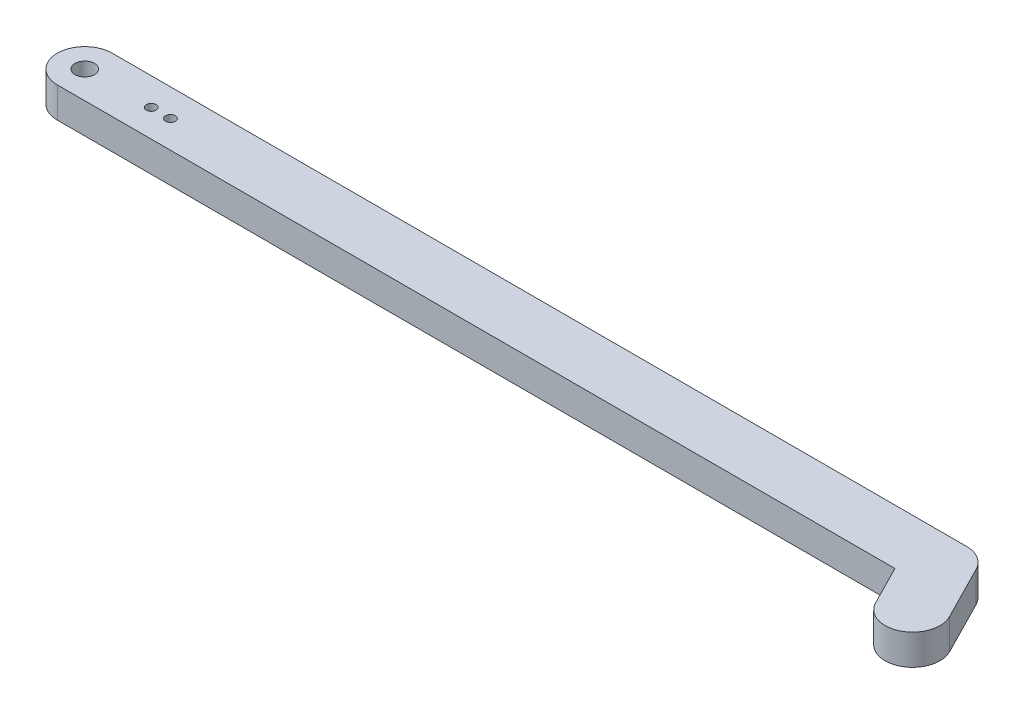
ISO-10303-21;
HEADER;
FILE_DESCRIPTION(('STEP AP214'),'2;1');
FILE_NAME('part.step','',(''),(''),'','','');
FILE_SCHEMA(('AUTOMOTIVE_DESIGN { 1 0 10303 214 1 1 1 1 }'));
ENDSEC;
DATA;
#1=APPLICATION_CONTEXT('core data for automotive mechanical design processes');
#2=APPLICATION_PROTOCOL_DEFINITION('international standard','automotive_design',2000,#1);
#3=PRODUCT_CONTEXT('',#1,'mechanical');
#4=PRODUCT('Part','Part','',(#3));
#5=PRODUCT_RELATED_PRODUCT_CATEGORY('part','',(#4));
#6=PRODUCT_DEFINITION_FORMATION('','',#4);
#7=PRODUCT_DEFINITION_CONTEXT('part definition',#1,'design');
#8=PRODUCT_DEFINITION('design','',#6,#7);
#9=PRODUCT_DEFINITION_SHAPE('','',#8);
#10=(LENGTH_UNIT() NAMED_UNIT(*) SI_UNIT(.MILLI.,.METRE.));
#11=(NAMED_UNIT(*) PLANE_ANGLE_UNIT() SI_UNIT($,.RADIAN.));
#12=(NAMED_UNIT(*) SI_UNIT($,.STERADIAN.) SOLID_ANGLE_UNIT());
#13=UNCERTAINTY_MEASURE_WITH_UNIT(LENGTH_MEASURE(1.E-05),#10,'distance_accuracy_value','');
#14=(GEOMETRIC_REPRESENTATION_CONTEXT(3) GLOBAL_UNCERTAINTY_ASSIGNED_CONTEXT((#13)) GLOBAL_UNIT_ASSIGNED_CONTEXT((#10,
#11,#12)) REPRESENTATION_CONTEXT('',''));
#15=CARTESIAN_POINT('',(0.,0.,0.));
#16=DIRECTION('',(0.,0.,1.));
#17=DIRECTION('',(1.,0.,0.));
#18=AXIS2_PLACEMENT_3D('',#15,#16,#17);
#19=CARTESIAN_POINT('',(115.152938818831,5.,-58.6753130468341));
#20=DIRECTION('',(0.891000389081068,0.,-0.454002540364462));
#21=DIRECTION('',(-0.454002540364462,0.,-0.891000389081068));
#22=AXIS2_PLACEMENT_3D('',#19,#20,#21);
#23=PLANE('',#22);
#24=DIRECTION('',(0.454002540364462,0.,0.891000389081068));
#25=VECTOR('',#24,1.);
#26=CARTESIAN_POINT('',(115.152938818831,0.,-58.6753130468341));
#27=LINE('',#26,#25);
#28=CARTESIAN_POINT('',(144.009501750865,0.,-2.04301143164009));
#29=VERTEX_POINT('',#28);
#30=CARTESIAN_POINT('',(148.549527154509,0.,6.86699245917063));
#31=VERTEX_POINT('',#30);
#32=EDGE_CURVE('E155',#29,#31,#27,.T.);
#33=ORIENTED_EDGE('',*,*,#32,.F.);
#34=DIRECTION('',(0.,-1.,0.));
#35=VECTOR('',#34,1.);
#36=CARTESIAN_POINT('',(144.009501750865,5.,-2.04301143164009));
#37=LINE('',#36,#35);
#38=CARTESIAN_POINT('',(144.009501750865,5.,-2.04301143164009));
#39=VERTEX_POINT('',#38);
#40=EDGE_CURVE('E11',#39,#29,#37,.T.);
#41=ORIENTED_EDGE('',*,*,#40,.F.);
#42=DIRECTION('',(0.454002540364462,0.,0.891000389081068));
#43=VECTOR('',#42,1.);
#44=CARTESIAN_POINT('',(115.152938818831,5.,-58.6753130468341));
#45=LINE('',#44,#43);
#46=CARTESIAN_POINT('',(148.549527154509,5.,6.86699245917063));
#47=VERTEX_POINT('',#46);
#48=EDGE_CURVE('E189',#39,#47,#45,.T.);
#49=ORIENTED_EDGE('',*,*,#48,.T.);
#50=DIRECTION('',(0.,-1.,0.));
#51=VECTOR('',#50,1.);
#52=CARTESIAN_POINT('',(148.549527154509,5.,6.86699245917063));
#53=LINE('',#52,#51);
#54=EDGE_CURVE('E98',#47,#31,#53,.T.);
#55=ORIENTED_EDGE('',*,*,#54,.T.);
#56=EDGE_LOOP('',(#33,#41,#49,#55));
#57=FACE_BOUND('',#56,.T.);
#58=ADVANCED_FACE('F49',(#57),#23,.T.);
#59=CARTESIAN_POINT('',(140.,5.,0.));
#60=DIRECTION('',(0.,-1.,0.));
#61=DIRECTION('',(0.,0.,-1.));
#62=AXIS2_PLACEMENT_3D('',#59,#60,#61);
#63=CYLINDRICAL_SURFACE('',#62,4.5);
#64=CARTESIAN_POINT('',(140.,0.,0.));
#65=DIRECTION('',(0.,1.,0.));
#66=DIRECTION('',(0.,0.,1.));
#67=AXIS2_PLACEMENT_3D('',#64,#65,#66);
#68=CIRCLE('',#67,4.5);
#69=CARTESIAN_POINT('',(140.,0.,-4.5));
#70=VERTEX_POINT('',#69);
#71=EDGE_CURVE('E159',#29,#70,#68,.T.);
#72=ORIENTED_EDGE('',*,*,#71,.T.);
#73=DIRECTION('',(0.,-1.,0.));
#74=VECTOR('',#73,1.);
#75=CARTESIAN_POINT('',(140.,5.,-4.5));
#76=LINE('',#75,#74);
#77=CARTESIAN_POINT('',(140.,5.,-4.5));
#78=VERTEX_POINT('',#77);
#79=EDGE_CURVE('E58',#78,#70,#76,.T.);
#80=ORIENTED_EDGE('',*,*,#79,.F.);
#81=CARTESIAN_POINT('',(140.,5.,0.));
#82=DIRECTION('',(0.,1.,0.));
#83=DIRECTION('',(0.,0.,1.));
#84=AXIS2_PLACEMENT_3D('',#81,#82,#83);
#85=CIRCLE('',#84,4.5);
#86=EDGE_CURVE('E215',#39,#78,#85,.T.);
#87=ORIENTED_EDGE('',*,*,#86,.F.);
#88=ORIENTED_EDGE('',*,*,#40,.T.);
#89=EDGE_LOOP('',(#72,#80,#87,#88));
#90=FACE_BOUND('',#89,.T.);
#91=ADVANCED_FACE('F207',(#90),#63,.T.);
#92=CARTESIAN_POINT('',(0.,5.,-4.5));
#93=DIRECTION('',(0.,0.,-1.));
#94=DIRECTION('',(-1.,0.,0.));
#95=AXIS2_PLACEMENT_3D('',#92,#93,#94);
#96=PLANE('',#95);
#97=DIRECTION('',(1.,0.,0.));
#98=VECTOR('',#97,1.);
#99=CARTESIAN_POINT('',(0.,0.,-4.5));
#100=LINE('',#99,#98);
#101=CARTESIAN_POINT('',(0.,0.,-4.5));
#102=VERTEX_POINT('',#101);
#103=EDGE_CURVE('E163',#102,#70,#100,.T.);
#104=ORIENTED_EDGE('',*,*,#103,.F.);
#105=DIRECTION('',(0.,-1.,0.));
#106=VECTOR('',#105,1.);
#107=CARTESIAN_POINT('',(0.,5.,-4.5));
#108=LINE('',#107,#106);
#109=CARTESIAN_POINT('',(0.,5.,-4.5));
#110=VERTEX_POINT('',#109);
#111=EDGE_CURVE('E196',#110,#102,#108,.T.);
#112=ORIENTED_EDGE('',*,*,#111,.F.);
#113=DIRECTION('',(1.,0.,0.));
#114=VECTOR('',#113,1.);
#115=CARTESIAN_POINT('',(0.,5.,-4.5));
#116=LINE('',#115,#114);
#117=EDGE_CURVE('E204',#110,#78,#116,.T.);
#118=ORIENTED_EDGE('',*,*,#117,.T.);
#119=ORIENTED_EDGE('',*,*,#79,.T.);
#120=EDGE_LOOP('',(#104,#112,#118,#119));
#121=FACE_BOUND('',#120,.T.);
#122=ADVANCED_FACE('F203',(#121),#96,.T.);
#123=CARTESIAN_POINT('',(0.,5.,0.));
#124=DIRECTION('',(0.,-1.,0.));
#125=DIRECTION('',(0.,0.,-1.));
#126=AXIS2_PLACEMENT_3D('',#123,#124,#125);
#127=CYLINDRICAL_SURFACE('',#126,4.5);
#128=CARTESIAN_POINT('',(0.,0.,0.));
#129=DIRECTION('',(0.,1.,0.));
#130=DIRECTION('',(0.,0.,1.));
#131=AXIS2_PLACEMENT_3D('',#128,#129,#130);
#132=CIRCLE('',#131,4.5);
#133=CARTESIAN_POINT('',(0.,0.,4.5));
#134=VERTEX_POINT('',#133);
#135=EDGE_CURVE('E167',#102,#134,#132,.T.);
#136=ORIENTED_EDGE('',*,*,#135,.T.);
#137=DIRECTION('',(0.,-1.,0.));
#138=VECTOR('',#137,1.);
#139=CARTESIAN_POINT('',(0.,5.,4.5));
#140=LINE('',#139,#138);
#141=CARTESIAN_POINT('',(0.,5.,4.5));
#142=VERTEX_POINT('',#141);
#143=EDGE_CURVE('E133',#142,#134,#140,.T.);
#144=ORIENTED_EDGE('',*,*,#143,.F.);
#145=CARTESIAN_POINT('',(0.,5.,0.));
#146=DIRECTION('',(0.,1.,0.));
#147=DIRECTION('',(0.,0.,1.));
#148=AXIS2_PLACEMENT_3D('',#145,#146,#147);
#149=CIRCLE('',#148,4.5);
#150=EDGE_CURVE('E122',#110,#142,#149,.T.);
#151=ORIENTED_EDGE('',*,*,#150,.F.);
#152=ORIENTED_EDGE('',*,*,#111,.T.);
#153=EDGE_LOOP('',(#136,#144,#151,#152));
#154=FACE_BOUND('',#153,.T.);
#155=ADVANCED_FACE('F213',(#154),#127,.T.);
#156=CARTESIAN_POINT('',(0.,5.,4.5));
#157=DIRECTION('',(0.,0.,-1.));
#158=DIRECTION('',(-1.,0.,0.));
#159=AXIS2_PLACEMENT_3D('',#156,#157,#158);
#160=PLANE('',#159);
#161=DIRECTION('',(1.,0.,0.));
#162=VECTOR('',#161,1.);
#163=CARTESIAN_POINT('',(0.,0.,4.5));
#164=LINE('',#163,#162);
#165=CARTESIAN_POINT('',(137.242438276717,0.,4.5));
#166=VERTEX_POINT('',#165);
#167=EDGE_CURVE('E131',#134,#166,#164,.T.);
#168=ORIENTED_EDGE('',*,*,#167,.T.);
#169=DIRECTION('',(0.,-1.,0.));
#170=VECTOR('',#169,1.);
#171=CARTESIAN_POINT('',(137.242438276717,5.,4.5));
#172=LINE('',#171,#170);
#173=CARTESIAN_POINT('',(137.242438276717,5.,4.5));
#174=VERTEX_POINT('',#173);
#175=EDGE_CURVE('E128',#174,#166,#172,.T.);
#176=ORIENTED_EDGE('',*,*,#175,.F.);
#177=DIRECTION('',(1.,0.,0.));
#178=VECTOR('',#177,1.);
#179=CARTESIAN_POINT('',(0.,5.,4.5));
#180=LINE('',#179,#178);
#181=EDGE_CURVE('E114',#142,#174,#180,.T.);
#182=ORIENTED_EDGE('',*,*,#181,.F.);
#183=ORIENTED_EDGE('',*,*,#143,.T.);
#184=EDGE_LOOP('',(#168,#176,#182,#183));
#185=FACE_BOUND('',#184,.T.);
#186=ADVANCED_FACE('F129',(#185),#160,.F.);
#187=CARTESIAN_POINT('',(107.133935317101,5.,-54.589290183554));
#188=DIRECTION('',(0.891000389081068,0.,-0.454002540364462));
#189=DIRECTION('',(-0.454002540364462,0.,-0.891000389081068));
#190=AXIS2_PLACEMENT_3D('',#187,#188,#189);
#191=PLANE('',#190);
#192=DIRECTION('',(0.454002540364462,0.,0.891000389081068));
#193=VECTOR('',#192,1.);
#194=CARTESIAN_POINT('',(107.133935317101,0.,-54.589290183554));
#195=LINE('',#194,#193);
#196=CARTESIAN_POINT('',(140.53052365278,0.,10.9530153224508));
#197=VERTEX_POINT('',#196);
#198=EDGE_CURVE('E91',#166,#197,#195,.T.);
#199=ORIENTED_EDGE('',*,*,#198,.T.);
#200=DIRECTION('',(0.,-1.,0.));
#201=VECTOR('',#200,1.);
#202=CARTESIAN_POINT('',(140.53052365278,5.,10.9530153224508));
#203=LINE('',#202,#201);
#204=CARTESIAN_POINT('',(140.53052365278,5.,10.9530153224508));
#205=VERTEX_POINT('',#204);
#206=EDGE_CURVE('E134',#205,#197,#203,.T.);
#207=ORIENTED_EDGE('',*,*,#206,.F.);
#208=DIRECTION('',(0.454002540364462,0.,0.891000389081068));
#209=VECTOR('',#208,1.);
#210=CARTESIAN_POINT('',(107.133935317101,5.,-54.589290183554));
#211=LINE('',#210,#209);
#212=EDGE_CURVE('E119',#174,#205,#211,.T.);
#213=ORIENTED_EDGE('',*,*,#212,.F.);
#214=ORIENTED_EDGE('',*,*,#175,.T.);
#215=EDGE_LOOP('',(#199,#207,#213,#214));
#216=FACE_BOUND('',#215,.T.);
#217=ADVANCED_FACE('F136',(#216),#191,.F.);
#218=CARTESIAN_POINT('',(10.88,5.,0.));
#219=DIRECTION('',(0.,-1.,0.));
#220=DIRECTION('',(0.,0.,-1.));
#221=AXIS2_PLACEMENT_3D('',#218,#219,#220);
#222=CYLINDRICAL_SURFACE('',#221,0.800000000000001);
#223=CARTESIAN_POINT('',(10.88,5.,0.));
#224=DIRECTION('',(0.,1.,0.));
#225=DIRECTION('',(0.,0.,1.));
#226=AXIS2_PLACEMENT_3D('',#223,#224,#225);
#227=CIRCLE('',#226,0.800000000000001);
#228=CARTESIAN_POINT('',(10.88,5.,0.800000000000001));
#229=VERTEX_POINT('',#228);
#230=EDGE_CURVE('E147',#229,#229,#227,.T.);
#231=ORIENTED_EDGE('',*,*,#230,.T.);
#232=EDGE_LOOP('',(#231));
#233=FACE_BOUND('',#232,.T.);
#234=CARTESIAN_POINT('',(10.88,0.,0.));
#235=DIRECTION('',(0.,1.,0.));
#236=DIRECTION('',(0.,0.,1.));
#237=AXIS2_PLACEMENT_3D('',#234,#235,#236);
#238=CIRCLE('',#237,0.800000000000001);
#239=CARTESIAN_POINT('',(10.88,0.,0.800000000000001));
#240=VERTEX_POINT('',#239);
#241=EDGE_CURVE('E181',#240,#240,#238,.T.);
#242=ORIENTED_EDGE('',*,*,#241,.F.);
#243=EDGE_LOOP('',(#242));
#244=FACE_BOUND('',#243,.T.);
#245=ADVANCED_FACE('F237',(#233,#244),#222,.F.);
#246=CARTESIAN_POINT('',(14.03,5.,0.));
#247=DIRECTION('',(0.,-1.,0.));
#248=DIRECTION('',(0.,0.,-1.));
#249=AXIS2_PLACEMENT_3D('',#246,#247,#248);
#250=CYLINDRICAL_SURFACE('',#249,0.799999999999999);
#251=CARTESIAN_POINT('',(14.03,5.,0.));
#252=DIRECTION('',(0.,1.,0.));
#253=DIRECTION('',(0.,0.,1.));
#254=AXIS2_PLACEMENT_3D('',#251,#252,#253);
#255=CIRCLE('',#254,0.799999999999999);
#256=CARTESIAN_POINT('',(14.03,5.,0.799999999999999));
#257=VERTEX_POINT('',#256);
#258=EDGE_CURVE('E140',#257,#257,#255,.T.);
#259=ORIENTED_EDGE('',*,*,#258,.T.);
#260=EDGE_LOOP('',(#259));
#261=FACE_BOUND('',#260,.T.);
#262=CARTESIAN_POINT('',(14.03,0.,0.));
#263=DIRECTION('',(0.,1.,0.));
#264=DIRECTION('',(0.,0.,1.));
#265=AXIS2_PLACEMENT_3D('',#262,#263,#264);
#266=CIRCLE('',#265,0.799999999999999);
#267=CARTESIAN_POINT('',(14.03,0.,0.799999999999999));
#268=VERTEX_POINT('',#267);
#269=EDGE_CURVE('E177',#268,#268,#266,.T.);
#270=ORIENTED_EDGE('',*,*,#269,.F.);
#271=EDGE_LOOP('',(#270));
#272=FACE_BOUND('',#271,.T.);
#273=ADVANCED_FACE('F242',(#261,#272),#250,.F.);
#274=CARTESIAN_POINT('',(144.540025403645,5.,8.91000389081069));
#275=DIRECTION('',(0.,-1.,0.));
#276=DIRECTION('',(0.,0.,-1.));
#277=AXIS2_PLACEMENT_3D('',#274,#275,#276);
#278=CYLINDRICAL_SURFACE('',#277,4.50000000000001);
#279=CARTESIAN_POINT('',(144.540025403645,0.,8.91000389081069));
#280=DIRECTION('',(0.,1.,0.));
#281=DIRECTION('',(0.,0.,1.));
#282=AXIS2_PLACEMENT_3D('',#279,#280,#281);
#283=CIRCLE('',#282,4.50000000000001);
#284=EDGE_CURVE('E174',#197,#31,#283,.T.);
#285=ORIENTED_EDGE('',*,*,#284,.T.);
#286=ORIENTED_EDGE('',*,*,#54,.F.);
#287=CARTESIAN_POINT('',(144.540025403645,5.,8.91000389081069));
#288=DIRECTION('',(0.,1.,0.));
#289=DIRECTION('',(0.,0.,1.));
#290=AXIS2_PLACEMENT_3D('',#287,#288,#289);
#291=CIRCLE('',#290,4.50000000000001);
#292=EDGE_CURVE('E66',#205,#47,#291,.T.);
#293=ORIENTED_EDGE('',*,*,#292,.F.);
#294=ORIENTED_EDGE('',*,*,#206,.T.);
#295=EDGE_LOOP('',(#285,#286,#293,#294));
#296=FACE_BOUND('',#295,.T.);
#297=ADVANCED_FACE('F238',(#296),#278,.T.);
#298=CARTESIAN_POINT('',(0.,5.,0.));
#299=DIRECTION('',(0.,-1.,0.));
#300=DIRECTION('',(0.,0.,-1.));
#301=AXIS2_PLACEMENT_3D('',#298,#299,#300);
#302=CYLINDRICAL_SURFACE('',#301,1.6);
#303=CARTESIAN_POINT('',(0.,5.,0.));
#304=DIRECTION('',(0.,1.,0.));
#305=DIRECTION('',(0.,0.,1.));
#306=AXIS2_PLACEMENT_3D('',#303,#304,#305);
#307=CIRCLE('',#306,1.6);
#308=CARTESIAN_POINT('',(0.,5.,1.6));
#309=VERTEX_POINT('',#308);
#310=EDGE_CURVE('E151',#309,#309,#307,.T.);
#311=ORIENTED_EDGE('',*,*,#310,.T.);
#312=EDGE_LOOP('',(#311));
#313=FACE_BOUND('',#312,.T.);
#314=CARTESIAN_POINT('',(0.,0.,0.));
#315=DIRECTION('',(0.,1.,0.));
#316=DIRECTION('',(0.,0.,1.));
#317=AXIS2_PLACEMENT_3D('',#314,#315,#316);
#318=CIRCLE('',#317,1.6);
#319=CARTESIAN_POINT('',(0.,0.,1.6));
#320=VERTEX_POINT('',#319);
#321=EDGE_CURVE('E185',#320,#320,#318,.T.);
#322=ORIENTED_EDGE('',*,*,#321,.F.);
#323=EDGE_LOOP('',(#322));
#324=FACE_BOUND('',#323,.T.);
#325=ADVANCED_FACE('F241',(#313,#324),#302,.F.);
#326=CARTESIAN_POINT('',(0.,5.,0.));
#327=DIRECTION('',(0.,1.,0.));
#328=DIRECTION('',(0.,0.,1.));
#329=AXIS2_PLACEMENT_3D('',#326,#327,#328);
#330=PLANE('',#329);
#331=ORIENTED_EDGE('',*,*,#48,.F.);
#332=ORIENTED_EDGE('',*,*,#86,.T.);
#333=ORIENTED_EDGE('',*,*,#117,.F.);
#334=ORIENTED_EDGE('',*,*,#150,.T.);
#335=ORIENTED_EDGE('',*,*,#181,.T.);
#336=ORIENTED_EDGE('',*,*,#212,.T.);
#337=ORIENTED_EDGE('',*,*,#292,.T.);
#338=EDGE_LOOP('',(#331,#332,#333,#334,#335,#336,#337));
#339=FACE_BOUND('',#338,.T.);
#340=ORIENTED_EDGE('',*,*,#258,.F.);
#341=EDGE_LOOP('',(#340));
#342=FACE_BOUND('',#341,.T.);
#343=ORIENTED_EDGE('',*,*,#230,.F.);
#344=EDGE_LOOP('',(#343));
#345=FACE_BOUND('',#344,.T.);
#346=ORIENTED_EDGE('',*,*,#310,.F.);
#347=EDGE_LOOP('',(#346));
#348=FACE_BOUND('',#347,.T.);
#349=ADVANCED_FACE('F116',(#339,#342,#345,#348),#330,.T.);
#350=CARTESIAN_POINT('',(0.,0.,0.));
#351=DIRECTION('',(0.,1.,0.));
#352=DIRECTION('',(0.,0.,1.));
#353=AXIS2_PLACEMENT_3D('',#350,#351,#352);
#354=PLANE('',#353);
#355=ORIENTED_EDGE('',*,*,#32,.T.);
#356=ORIENTED_EDGE('',*,*,#284,.F.);
#357=ORIENTED_EDGE('',*,*,#198,.F.);
#358=ORIENTED_EDGE('',*,*,#167,.F.);
#359=ORIENTED_EDGE('',*,*,#135,.F.);
#360=ORIENTED_EDGE('',*,*,#103,.T.);
#361=ORIENTED_EDGE('',*,*,#71,.F.);
#362=EDGE_LOOP('',(#355,#356,#357,#358,#359,#360,#361));
#363=FACE_BOUND('',#362,.T.);
#364=ORIENTED_EDGE('',*,*,#269,.T.);
#365=EDGE_LOOP('',(#364));
#366=FACE_BOUND('',#365,.T.);
#367=ORIENTED_EDGE('',*,*,#241,.T.);
#368=EDGE_LOOP('',(#367));
#369=FACE_BOUND('',#368,.T.);
#370=ORIENTED_EDGE('',*,*,#321,.T.);
#371=EDGE_LOOP('',(#370));
#372=FACE_BOUND('',#371,.T.);
#373=ADVANCED_FACE('F210',(#363,#366,#369,#372),#354,.F.);
#374=CLOSED_SHELL('',(#58,#91,#122,#155,#186,#217,#245,#273,#297,#325,#349,#373));
#375=MANIFOLD_SOLID_BREP('B2',#374);
#376=ADVANCED_BREP_SHAPE_REPRESENTATION('',(#18,#375),#14);
#377=SHAPE_DEFINITION_REPRESENTATION(#9,#376);
ENDSEC;
END-ISO-10303-21;
